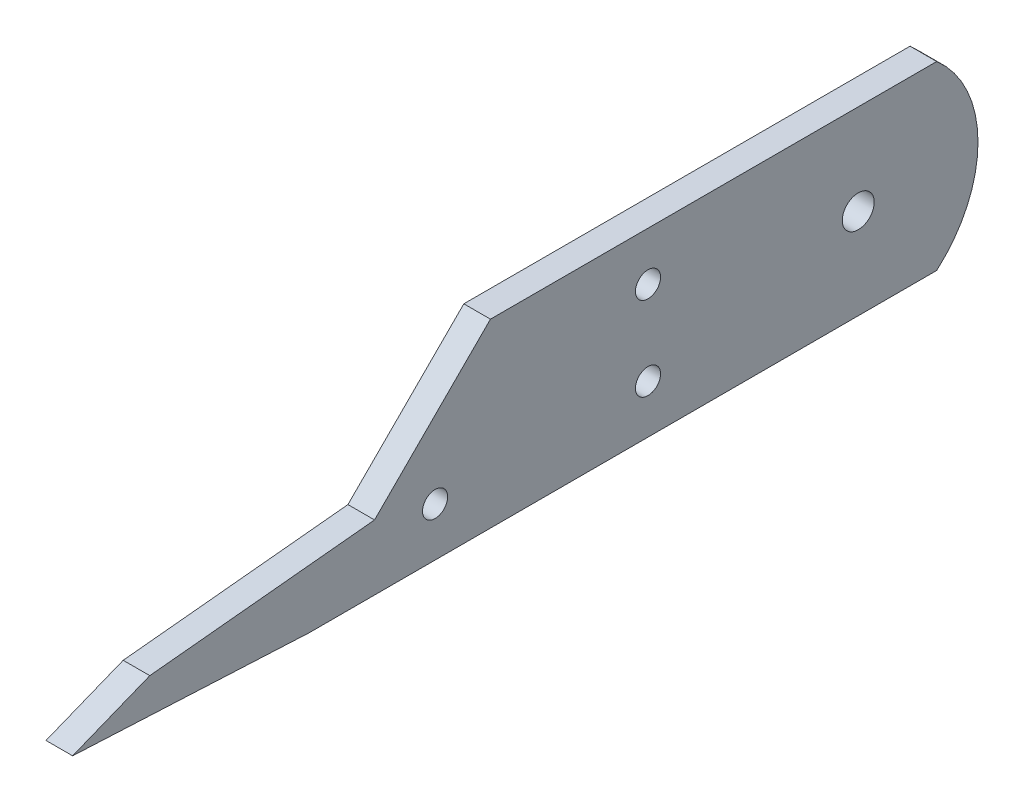
ISO-10303-21;
HEADER;
FILE_DESCRIPTION(('STEP AP214'),'2;1');
FILE_NAME('part.step','',(''),(''),'','','');
FILE_SCHEMA(('AUTOMOTIVE_DESIGN { 1 0 10303 214 1 1 1 1 }'));
ENDSEC;
DATA;
#1=APPLICATION_CONTEXT('core data for automotive mechanical design processes');
#2=APPLICATION_PROTOCOL_DEFINITION('international standard','automotive_design',2000,#1);
#3=PRODUCT_CONTEXT('',#1,'mechanical');
#4=PRODUCT('Part','Part','',(#3));
#5=PRODUCT_RELATED_PRODUCT_CATEGORY('part','',(#4));
#6=PRODUCT_DEFINITION_FORMATION('','',#4);
#7=PRODUCT_DEFINITION_CONTEXT('part definition',#1,'design');
#8=PRODUCT_DEFINITION('design','',#6,#7);
#9=PRODUCT_DEFINITION_SHAPE('','',#8);
#10=(LENGTH_UNIT() NAMED_UNIT(*) SI_UNIT(.MILLI.,.METRE.));
#11=(NAMED_UNIT(*) PLANE_ANGLE_UNIT() SI_UNIT($,.RADIAN.));
#12=(NAMED_UNIT(*) SI_UNIT($,.STERADIAN.) SOLID_ANGLE_UNIT());
#13=UNCERTAINTY_MEASURE_WITH_UNIT(LENGTH_MEASURE(1.E-05),#10,'distance_accuracy_value','');
#14=(GEOMETRIC_REPRESENTATION_CONTEXT(3) GLOBAL_UNCERTAINTY_ASSIGNED_CONTEXT((#13)) GLOBAL_UNIT_ASSIGNED_CONTEXT((#10,
#11,#12)) REPRESENTATION_CONTEXT('',''));
#15=CARTESIAN_POINT('',(0.,0.,0.));
#16=DIRECTION('',(0.,0.,1.));
#17=DIRECTION('',(1.,0.,0.));
#18=AXIS2_PLACEMENT_3D('',#15,#16,#17);
#19=CARTESIAN_POINT('',(6.35,43.18,0.));
#20=DIRECTION('',(0.,-1.,0.));
#21=DIRECTION('',(0.,0.,-1.));
#22=AXIS2_PLACEMENT_3D('',#19,#20,#21);
#23=PLANE('',#22);
#24=DIRECTION('',(0.,0.,1.));
#25=VECTOR('',#24,1.);
#26=CARTESIAN_POINT('',(0.,43.18,0.));
#27=LINE('',#26,#25);
#28=CARTESIAN_POINT('',(0.,43.18,-43.4811108330197));
#29=VERTEX_POINT('',#28);
#30=CARTESIAN_POINT('',(0.,43.18,62.9919999999995));
#31=VERTEX_POINT('',#30);
#32=EDGE_CURVE('E117',#29,#31,#27,.T.);
#33=ORIENTED_EDGE('',*,*,#32,.T.);
#34=DIRECTION('',(-1.,0.,0.));
#35=VECTOR('',#34,1.);
#36=CARTESIAN_POINT('',(6.35,43.18,62.9919999999995));
#37=LINE('',#36,#35);
#38=CARTESIAN_POINT('',(6.35,43.18,62.9919999999995));
#39=VERTEX_POINT('',#38);
#40=EDGE_CURVE('E11',#39,#31,#37,.T.);
#41=ORIENTED_EDGE('',*,*,#40,.F.);
#42=DIRECTION('',(0.,0.,1.));
#43=VECTOR('',#42,1.);
#44=CARTESIAN_POINT('',(6.35,43.18,0.));
#45=LINE('',#44,#43);
#46=CARTESIAN_POINT('',(6.34999999999999,43.18,-43.4811108330197));
#47=VERTEX_POINT('',#46);
#48=EDGE_CURVE('E103',#47,#39,#45,.T.);
#49=ORIENTED_EDGE('',*,*,#48,.F.);
#50=DIRECTION('',(-1.,0.,0.));
#51=VECTOR('',#50,1.);
#52=CARTESIAN_POINT('',(80.1238835157808,43.18,-43.4811108330197));
#53=LINE('',#52,#51);
#54=EDGE_CURVE('E112',#47,#29,#53,.T.);
#55=ORIENTED_EDGE('',*,*,#54,.T.);
#56=EDGE_LOOP('',(#33,#41,#49,#55));
#57=FACE_BOUND('',#56,.T.);
#58=ADVANCED_FACE('F33',(#57),#23,.F.);
#59=CARTESIAN_POINT('',(6.35,0.,106.172));
#60=DIRECTION('',(0.,-0.707106781186551,-0.707106781186544));
#61=DIRECTION('',(0.,0.707106781186544,-0.707106781186551));
#62=AXIS2_PLACEMENT_3D('',#59,#60,#61);
#63=PLANE('',#62);
#64=DIRECTION('',(0.,-0.707106781186544,0.707106781186551));
#65=VECTOR('',#64,1.);
#66=CARTESIAN_POINT('',(0.,0.,106.172));
#67=LINE('',#66,#65);
#68=CARTESIAN_POINT('',(0.,15.5222222222222,90.6497777777777));
#69=VERTEX_POINT('',#68);
#70=EDGE_CURVE('E104',#31,#69,#67,.T.);
#71=ORIENTED_EDGE('',*,*,#70,.T.);
#72=DIRECTION('',(1.,0.,0.));
#73=VECTOR('',#72,1.);
#74=CARTESIAN_POINT('',(6.35,15.5222222222222,90.6497777777776));
#75=LINE('',#74,#73);
#76=CARTESIAN_POINT('',(6.35,15.5222222222222,90.6497777777777));
#77=VERTEX_POINT('',#76);
#78=EDGE_CURVE('E55',#69,#77,#75,.T.);
#79=ORIENTED_EDGE('',*,*,#78,.T.);
#80=DIRECTION('',(0.,-0.707106781186544,0.707106781186551));
#81=VECTOR('',#80,1.);
#82=CARTESIAN_POINT('',(6.35,0.,106.172));
#83=LINE('',#82,#81);
#84=EDGE_CURVE('E168',#39,#77,#83,.T.);
#85=ORIENTED_EDGE('',*,*,#84,.F.);
#86=ORIENTED_EDGE('',*,*,#40,.T.);
#87=EDGE_LOOP('',(#71,#79,#85,#86));
#88=FACE_BOUND('',#87,.T.);
#89=ADVANCED_FACE('F172',(#88),#63,.F.);
#90=CARTESIAN_POINT('',(6.35,0.,0.));
#91=DIRECTION('',(0.,1.,0.));
#92=DIRECTION('',(0.,0.,1.));
#93=AXIS2_PLACEMENT_3D('',#90,#91,#92);
#94=PLANE('',#93);
#95=DIRECTION('',(0.,0.,-1.));
#96=VECTOR('',#95,1.);
#97=CARTESIAN_POINT('',(6.35,0.,0.));
#98=LINE('',#97,#96);
#99=CARTESIAN_POINT('',(6.35,0.,106.172));
#100=VERTEX_POINT('',#99);
#101=CARTESIAN_POINT('',(6.34999999999999,0.,-43.4811108330197));
#102=VERTEX_POINT('',#101);
#103=EDGE_CURVE('E40',#100,#102,#98,.T.);
#104=ORIENTED_EDGE('',*,*,#103,.F.);
#105=DIRECTION('',(1.,0.,0.));
#106=VECTOR('',#105,1.);
#107=CARTESIAN_POINT('',(0.,0.,106.172));
#108=LINE('',#107,#106);
#109=CARTESIAN_POINT('',(0.,0.,106.172));
#110=VERTEX_POINT('',#109);
#111=EDGE_CURVE('E99',#110,#100,#108,.T.);
#112=ORIENTED_EDGE('',*,*,#111,.F.);
#113=DIRECTION('',(0.,0.,-1.));
#114=VECTOR('',#113,1.);
#115=CARTESIAN_POINT('',(0.,0.,0.));
#116=LINE('',#115,#114);
#117=CARTESIAN_POINT('',(0.,0.,-43.4811108330197));
#118=VERTEX_POINT('',#117);
#119=EDGE_CURVE('E93',#110,#118,#116,.T.);
#120=ORIENTED_EDGE('',*,*,#119,.T.);
#121=DIRECTION('',(-1.,0.,0.));
#122=VECTOR('',#121,1.);
#123=CARTESIAN_POINT('',(80.1238835157808,0.,-43.4811108330197));
#124=LINE('',#123,#122);
#125=EDGE_CURVE('E97',#102,#118,#124,.T.);
#126=ORIENTED_EDGE('',*,*,#125,.F.);
#127=EDGE_LOOP('',(#104,#112,#120,#126));
#128=FACE_BOUND('',#127,.T.);
#129=ADVANCED_FACE('F96',(#128),#94,.F.);
#130=CARTESIAN_POINT('',(6.35,21.59,-24.7620690573304));
#131=DIRECTION('',(1.,0.,0.));
#132=DIRECTION('',(0.,0.,-1.));
#133=AXIS2_PLACEMENT_3D('',#130,#131,#132);
#134=PLANE('',#133);
#135=CARTESIAN_POINT('',(6.34999999999999,21.59,-24.7620690573304));
#136=DIRECTION('',(1.,0.,0.));
#137=DIRECTION('',(0.,0.,-1.));
#138=AXIS2_PLACEMENT_3D('',#135,#136,#137);
#139=CIRCLE('',#138,28.575);
#140=EDGE_CURVE('E111',#47,#102,#139,.F.);
#141=ORIENTED_EDGE('',*,*,#140,.F.);
#142=ORIENTED_EDGE('',*,*,#48,.T.);
#143=ORIENTED_EDGE('',*,*,#84,.T.);
#144=DIRECTION('',(0.,-0.0995037190209988,0.995037190209989));
#145=VECTOR('',#144,1.);
#146=CARTESIAN_POINT('',(6.35,10.16,144.272));
#147=LINE('',#146,#145);
#148=CARTESIAN_POINT('',(6.35,10.16,144.272));
#149=VERTEX_POINT('',#148);
#150=EDGE_CURVE('E152',#77,#149,#147,.T.);
#151=ORIENTED_EDGE('',*,*,#150,.T.);
#152=DIRECTION('',(0.,-0.371390676354104,0.928476690885259));
#153=VECTOR('',#152,1.);
#154=CARTESIAN_POINT('',(6.35,0.,169.672));
#155=LINE('',#154,#153);
#156=CARTESIAN_POINT('',(6.35,2.794,162.687));
#157=VERTEX_POINT('',#156);
#158=EDGE_CURVE('E159',#149,#157,#155,.T.);
#159=ORIENTED_EDGE('',*,*,#158,.T.);
#160=DIRECTION('',(0.,0.0493778959312991,0.998780167701281));
#161=VECTOR('',#160,1.);
#162=CARTESIAN_POINT('',(6.35,0.,106.172));
#163=LINE('',#162,#161);
#164=EDGE_CURVE('E47',#100,#157,#163,.T.);
#165=ORIENTED_EDGE('',*,*,#164,.F.);
#166=ORIENTED_EDGE('',*,*,#103,.T.);
#167=EDGE_LOOP('',(#141,#142,#143,#151,#159,#165,#166));
#168=FACE_BOUND('',#167,.T.);
#169=CARTESIAN_POINT('',(6.35,31.59,25.4));
#170=DIRECTION('',(1.,0.,0.));
#171=DIRECTION('',(0.,0.,-1.));
#172=AXIS2_PLACEMENT_3D('',#169,#170,#171);
#173=CIRCLE('',#172,3.);
#174=CARTESIAN_POINT('',(6.35,31.59,22.4));
#175=VERTEX_POINT('',#174);
#176=EDGE_CURVE('E133',#175,#175,#173,.T.);
#177=ORIENTED_EDGE('',*,*,#176,.F.);
#178=EDGE_LOOP('',(#177));
#179=FACE_BOUND('',#178,.T.);
#180=CARTESIAN_POINT('',(6.35,11.59,25.4));
#181=DIRECTION('',(1.,0.,0.));
#182=DIRECTION('',(0.,0.,-1.));
#183=AXIS2_PLACEMENT_3D('',#180,#181,#182);
#184=CIRCLE('',#183,3.);
#185=CARTESIAN_POINT('',(6.35,11.59,22.4));
#186=VERTEX_POINT('',#185);
#187=EDGE_CURVE('E139',#186,#186,#184,.T.);
#188=ORIENTED_EDGE('',*,*,#187,.F.);
#189=EDGE_LOOP('',(#188));
#190=FACE_BOUND('',#189,.T.);
#191=CARTESIAN_POINT('',(6.35,11.59,76.2));
#192=DIRECTION('',(1.,0.,0.));
#193=DIRECTION('',(0.,0.,-1.));
#194=AXIS2_PLACEMENT_3D('',#191,#192,#193);
#195=CIRCLE('',#194,3.00000000000001);
#196=CARTESIAN_POINT('',(6.35,11.59,73.2));
#197=VERTEX_POINT('',#196);
#198=EDGE_CURVE('E123',#197,#197,#195,.T.);
#199=ORIENTED_EDGE('',*,*,#198,.F.);
#200=EDGE_LOOP('',(#199));
#201=FACE_BOUND('',#200,.T.);
#202=CARTESIAN_POINT('',(6.34999999999999,21.59,-24.7620690573304));
#203=DIRECTION('',(1.,0.,0.));
#204=DIRECTION('',(0.,0.,-1.));
#205=AXIS2_PLACEMENT_3D('',#202,#203,#204);
#206=CIRCLE('',#205,3.81);
#207=CARTESIAN_POINT('',(6.34999999999998,21.59,-20.9520690573304));
#208=VERTEX_POINT('',#207);
#209=EDGE_CURVE('E119',#208,#208,#206,.F.);
#210=ORIENTED_EDGE('',*,*,#209,.T.);
#211=EDGE_LOOP('',(#210));
#212=FACE_BOUND('',#211,.T.);
#213=ADVANCED_FACE('F184',(#168,#179,#190,#201,#212),#134,.T.);
#214=CARTESIAN_POINT('',(0.,21.59,-24.7620690573304));
#215=DIRECTION('',(1.,0.,0.));
#216=DIRECTION('',(0.,0.,-1.));
#217=AXIS2_PLACEMENT_3D('',#214,#215,#216);
#218=PLANE('',#217);
#219=ORIENTED_EDGE('',*,*,#32,.F.);
#220=CARTESIAN_POINT('',(0.,21.59,-24.7620690573304));
#221=DIRECTION('',(-1.,0.,0.));
#222=DIRECTION('',(0.,0.,1.));
#223=AXIS2_PLACEMENT_3D('',#220,#221,#222);
#224=CIRCLE('',#223,28.575);
#225=EDGE_CURVE('E109',#29,#118,#224,.T.);
#226=ORIENTED_EDGE('',*,*,#225,.T.);
#227=ORIENTED_EDGE('',*,*,#119,.F.);
#228=DIRECTION('',(0.,0.0493778959312991,0.998780167701281));
#229=VECTOR('',#228,1.);
#230=CARTESIAN_POINT('',(0.,0.,106.172));
#231=LINE('',#230,#229);
#232=CARTESIAN_POINT('',(0.,2.794,162.687));
#233=VERTEX_POINT('',#232);
#234=EDGE_CURVE('E147',#110,#233,#231,.T.);
#235=ORIENTED_EDGE('',*,*,#234,.T.);
#236=DIRECTION('',(0.,0.371390676354104,-0.928476690885259));
#237=VECTOR('',#236,1.);
#238=CARTESIAN_POINT('',(0.,0.,169.672));
#239=LINE('',#238,#237);
#240=CARTESIAN_POINT('',(0.,10.16,144.272));
#241=VERTEX_POINT('',#240);
#242=EDGE_CURVE('E154',#233,#241,#239,.T.);
#243=ORIENTED_EDGE('',*,*,#242,.T.);
#244=DIRECTION('',(0.,0.0995037190209988,-0.995037190209989));
#245=VECTOR('',#244,1.);
#246=CARTESIAN_POINT('',(0.,10.16,144.272));
#247=LINE('',#246,#245);
#248=EDGE_CURVE('E156',#241,#69,#247,.T.);
#249=ORIENTED_EDGE('',*,*,#248,.T.);
#250=ORIENTED_EDGE('',*,*,#70,.F.);
#251=EDGE_LOOP('',(#219,#226,#227,#235,#243,#249,#250));
#252=FACE_BOUND('',#251,.T.);
#253=CARTESIAN_POINT('',(0.,31.59,25.4));
#254=DIRECTION('',(1.,0.,0.));
#255=DIRECTION('',(0.,0.,-1.));
#256=AXIS2_PLACEMENT_3D('',#253,#254,#255);
#257=CIRCLE('',#256,3.);
#258=CARTESIAN_POINT('',(0.,31.59,22.4));
#259=VERTEX_POINT('',#258);
#260=EDGE_CURVE('E130',#259,#259,#257,.T.);
#261=ORIENTED_EDGE('',*,*,#260,.T.);
#262=EDGE_LOOP('',(#261));
#263=FACE_BOUND('',#262,.T.);
#264=CARTESIAN_POINT('',(0.,11.59,25.4));
#265=DIRECTION('',(1.,0.,0.));
#266=DIRECTION('',(0.,0.,-1.));
#267=AXIS2_PLACEMENT_3D('',#264,#265,#266);
#268=CIRCLE('',#267,3.);
#269=CARTESIAN_POINT('',(0.,11.59,22.4));
#270=VERTEX_POINT('',#269);
#271=EDGE_CURVE('E136',#270,#270,#268,.T.);
#272=ORIENTED_EDGE('',*,*,#271,.T.);
#273=EDGE_LOOP('',(#272));
#274=FACE_BOUND('',#273,.T.);
#275=CARTESIAN_POINT('',(0.,11.59,76.2));
#276=DIRECTION('',(1.,0.,0.));
#277=DIRECTION('',(0.,0.,-1.));
#278=AXIS2_PLACEMENT_3D('',#275,#276,#277);
#279=CIRCLE('',#278,3.00000000000001);
#280=CARTESIAN_POINT('',(0.,11.59,73.2));
#281=VERTEX_POINT('',#280);
#282=EDGE_CURVE('E142',#281,#281,#279,.T.);
#283=ORIENTED_EDGE('',*,*,#282,.T.);
#284=EDGE_LOOP('',(#283));
#285=FACE_BOUND('',#284,.T.);
#286=CARTESIAN_POINT('',(0.,21.59,-24.7620690573304));
#287=DIRECTION('',(-1.,0.,0.));
#288=DIRECTION('',(0.,0.,1.));
#289=AXIS2_PLACEMENT_3D('',#286,#287,#288);
#290=CIRCLE('',#289,3.81);
#291=CARTESIAN_POINT('',(0.,21.59,-20.9520690573304));
#292=VERTEX_POINT('',#291);
#293=EDGE_CURVE('E120',#292,#292,#290,.T.);
#294=ORIENTED_EDGE('',*,*,#293,.F.);
#295=EDGE_LOOP('',(#294));
#296=FACE_BOUND('',#295,.T.);
#297=ADVANCED_FACE('F114',(#252,#263,#274,#285,#296),#218,.F.);
#298=CARTESIAN_POINT('',(-103.144017761575,10.16,144.272));
#299=DIRECTION('',(0.,0.995037190209989,0.0995037190209988));
#300=DIRECTION('',(0.,-0.0995037190209988,0.995037190209989));
#301=AXIS2_PLACEMENT_3D('',#298,#299,#300);
#302=PLANE('',#301);
#303=ORIENTED_EDGE('',*,*,#78,.F.);
#304=ORIENTED_EDGE('',*,*,#248,.F.);
#305=DIRECTION('',(1.,0.,0.));
#306=VECTOR('',#305,1.);
#307=CARTESIAN_POINT('',(-103.144017761575,10.16,144.272));
#308=LINE('',#307,#306);
#309=EDGE_CURVE('E157',#241,#149,#308,.T.);
#310=ORIENTED_EDGE('',*,*,#309,.T.);
#311=ORIENTED_EDGE('',*,*,#150,.F.);
#312=EDGE_LOOP('',(#303,#304,#310,#311));
#313=FACE_BOUND('',#312,.T.);
#314=ADVANCED_FACE('F177',(#313),#302,.T.);
#315=CARTESIAN_POINT('',(-103.144017761575,0.,169.672));
#316=DIRECTION('',(0.,0.928476690885259,0.371390676354104));
#317=DIRECTION('',(0.,-0.371390676354104,0.928476690885259));
#318=AXIS2_PLACEMENT_3D('',#315,#316,#317);
#319=PLANE('',#318);
#320=DIRECTION('',(1.,0.,0.));
#321=VECTOR('',#320,1.);
#322=CARTESIAN_POINT('',(0.,2.794,162.687));
#323=LINE('',#322,#321);
#324=EDGE_CURVE('E150',#233,#157,#323,.T.);
#325=ORIENTED_EDGE('',*,*,#324,.T.);
#326=ORIENTED_EDGE('',*,*,#158,.F.);
#327=ORIENTED_EDGE('',*,*,#309,.F.);
#328=ORIENTED_EDGE('',*,*,#242,.F.);
#329=EDGE_LOOP('',(#325,#326,#327,#328));
#330=FACE_BOUND('',#329,.T.);
#331=ADVANCED_FACE('F182',(#330),#319,.T.);
#332=CARTESIAN_POINT('',(0.,0.,106.172));
#333=DIRECTION('',(0.,0.99878016770128,-0.0493778959312991));
#334=DIRECTION('',(0.,0.0493778959312991,0.998780167701281));
#335=AXIS2_PLACEMENT_3D('',#332,#333,#334);
#336=PLANE('',#335);
#337=ORIENTED_EDGE('',*,*,#164,.T.);
#338=ORIENTED_EDGE('',*,*,#324,.F.);
#339=ORIENTED_EDGE('',*,*,#234,.F.);
#340=ORIENTED_EDGE('',*,*,#111,.T.);
#341=EDGE_LOOP('',(#337,#338,#339,#340));
#342=FACE_BOUND('',#341,.T.);
#343=ADVANCED_FACE('F204',(#342),#336,.F.);
#344=CARTESIAN_POINT('',(0.,11.59,76.2));
#345=DIRECTION('',(1.,0.,0.));
#346=DIRECTION('',(0.,0.,-1.));
#347=AXIS2_PLACEMENT_3D('',#344,#345,#346);
#348=CYLINDRICAL_SURFACE('',#347,3.00000000000001);
#349=ORIENTED_EDGE('',*,*,#282,.F.);
#350=EDGE_LOOP('',(#349));
#351=FACE_BOUND('',#350,.T.);
#352=ORIENTED_EDGE('',*,*,#198,.T.);
#353=EDGE_LOOP('',(#352));
#354=FACE_BOUND('',#353,.T.);
#355=ADVANCED_FACE('F207',(#351,#354),#348,.F.);
#356=CARTESIAN_POINT('',(0.,11.59,25.4));
#357=DIRECTION('',(1.,0.,0.));
#358=DIRECTION('',(0.,0.,-1.));
#359=AXIS2_PLACEMENT_3D('',#356,#357,#358);
#360=CYLINDRICAL_SURFACE('',#359,3.);
#361=ORIENTED_EDGE('',*,*,#271,.F.);
#362=EDGE_LOOP('',(#361));
#363=FACE_BOUND('',#362,.T.);
#364=ORIENTED_EDGE('',*,*,#187,.T.);
#365=EDGE_LOOP('',(#364));
#366=FACE_BOUND('',#365,.T.);
#367=ADVANCED_FACE('F210',(#363,#366),#360,.F.);
#368=CARTESIAN_POINT('',(0.,31.59,25.4));
#369=DIRECTION('',(1.,0.,0.));
#370=DIRECTION('',(0.,0.,-1.));
#371=AXIS2_PLACEMENT_3D('',#368,#369,#370);
#372=CYLINDRICAL_SURFACE('',#371,3.);
#373=ORIENTED_EDGE('',*,*,#260,.F.);
#374=EDGE_LOOP('',(#373));
#375=FACE_BOUND('',#374,.T.);
#376=ORIENTED_EDGE('',*,*,#176,.T.);
#377=EDGE_LOOP('',(#376));
#378=FACE_BOUND('',#377,.T.);
#379=ADVANCED_FACE('F214',(#375,#378),#372,.F.);
#380=CARTESIAN_POINT('',(80.1238835157808,21.59,-24.7620690573304));
#381=DIRECTION('',(-1.,0.,0.));
#382=DIRECTION('',(0.,0.,1.));
#383=AXIS2_PLACEMENT_3D('',#380,#381,#382);
#384=CYLINDRICAL_SURFACE('',#383,28.575);
#385=ORIENTED_EDGE('',*,*,#54,.F.);
#386=ORIENTED_EDGE('',*,*,#140,.T.);
#387=ORIENTED_EDGE('',*,*,#125,.T.);
#388=ORIENTED_EDGE('',*,*,#225,.F.);
#389=EDGE_LOOP('',(#385,#386,#387,#388));
#390=FACE_BOUND('',#389,.T.);
#391=ADVANCED_FACE('F108',(#390),#384,.T.);
#392=CARTESIAN_POINT('',(80.1238835157808,21.59,-24.7620690573304));
#393=DIRECTION('',(-1.,0.,0.));
#394=DIRECTION('',(0.,0.,1.));
#395=AXIS2_PLACEMENT_3D('',#392,#393,#394);
#396=CYLINDRICAL_SURFACE('',#395,3.81);
#397=CARTESIAN_POINT('',(0.,21.59,-20.9520690573304));
#398=CARTESIAN_POINT('',(0.0661458333333457,21.59,-20.9520690573304));
#399=CARTESIAN_POINT('',(0.132291666666678,21.59,-20.9520690573304));
#400=CARTESIAN_POINT('',(0.264583333333341,21.59,-20.9520690573304));
#401=CARTESIAN_POINT('',(0.330729166666673,21.59,-20.9520690573304));
#402=CARTESIAN_POINT('',(0.463020833333341,21.59,-20.9520690573304));
#403=CARTESIAN_POINT('',(0.529166666666678,21.59,-20.9520690573304));
#404=CARTESIAN_POINT('',(0.661458333333346,21.59,-20.9520690573304));
#405=CARTESIAN_POINT('',(0.727604166666678,21.59,-20.9520690573304));
#406=CARTESIAN_POINT('',(0.859895833333342,21.59,-20.9520690573304));
#407=CARTESIAN_POINT('',(0.926041666666673,21.59,-20.9520690573304));
#408=CARTESIAN_POINT('',(1.05833333333334,21.59,-20.9520690573304));
#409=CARTESIAN_POINT('',(1.12447916666668,21.59,-20.9520690573304));
#410=CARTESIAN_POINT('',(1.25677083333335,21.59,-20.9520690573304));
#411=CARTESIAN_POINT('',(1.32291666666668,21.59,-20.9520690573304));
#412=CARTESIAN_POINT('',(1.45520833333334,21.59,-20.9520690573304));
#413=CARTESIAN_POINT('',(1.52135416666667,21.59,-20.9520690573304));
#414=CARTESIAN_POINT('',(1.65364583333334,21.59,-20.9520690573304));
#415=CARTESIAN_POINT('',(1.71979166666667,21.59,-20.9520690573304));
#416=CARTESIAN_POINT('',(1.85208333333333,21.59,-20.9520690573304));
#417=CARTESIAN_POINT('',(1.91822916666666,21.59,-20.9520690573304));
#418=CARTESIAN_POINT('',(2.05052083333333,21.59,-20.9520690573304));
#419=CARTESIAN_POINT('',(2.11666666666667,21.59,-20.9520690573304));
#420=CARTESIAN_POINT('',(2.24895833333334,21.59,-20.9520690573304));
#421=CARTESIAN_POINT('',(2.31510416666667,21.59,-20.9520690573304));
#422=CARTESIAN_POINT('',(2.44739583333333,21.59,-20.9520690573304));
#423=CARTESIAN_POINT('',(2.51354166666667,21.59,-20.9520690573304));
#424=CARTESIAN_POINT('',(2.64583333333333,21.59,-20.9520690573304));
#425=CARTESIAN_POINT('',(2.71197916666667,21.59,-20.9520690573304));
#426=CARTESIAN_POINT('',(2.84427083333334,21.59,-20.9520690573304));
#427=CARTESIAN_POINT('',(2.91041666666667,21.59,-20.9520690573304));
#428=CARTESIAN_POINT('',(3.04270833333333,21.59,-20.9520690573304));
#429=CARTESIAN_POINT('',(3.10885416666667,21.59,-20.9520690573304));
#430=CARTESIAN_POINT('',(3.24114583333333,21.59,-20.9520690573304));
#431=CARTESIAN_POINT('',(3.30729166666666,21.59,-20.9520690573304));
#432=CARTESIAN_POINT('',(3.43958333333332,21.59,-20.9520690573304));
#433=CARTESIAN_POINT('',(3.50572916666666,21.59,-20.9520690573304));
#434=CARTESIAN_POINT('',(3.63802083333332,21.59,-20.9520690573304));
#435=CARTESIAN_POINT('',(3.70416666666666,21.59,-20.9520690573304));
#436=CARTESIAN_POINT('',(3.83645833333333,21.59,-20.9520690573304));
#437=CARTESIAN_POINT('',(3.90260416666666,21.59,-20.9520690573304));
#438=CARTESIAN_POINT('',(4.03489583333333,21.59,-20.9520690573304));
#439=CARTESIAN_POINT('',(4.10104166666666,21.59,-20.9520690573304));
#440=CARTESIAN_POINT('',(4.23333333333333,21.59,-20.9520690573304));
#441=CARTESIAN_POINT('',(4.29947916666666,21.59,-20.9520690573304));
#442=CARTESIAN_POINT('',(4.43177083333333,21.59,-20.9520690573304));
#443=CARTESIAN_POINT('',(4.49791666666666,21.59,-20.9520690573304));
#444=CARTESIAN_POINT('',(4.63020833333333,21.59,-20.9520690573304));
#445=CARTESIAN_POINT('',(4.69635416666666,21.59,-20.9520690573304));
#446=CARTESIAN_POINT('',(4.82864583333332,21.59,-20.9520690573304));
#447=CARTESIAN_POINT('',(4.89479166666665,21.59,-20.9520690573304));
#448=CARTESIAN_POINT('',(5.02708333333332,21.59,-20.9520690573304));
#449=CARTESIAN_POINT('',(5.09322916666665,21.59,-20.9520690573304));
#450=CARTESIAN_POINT('',(5.22552083333332,21.59,-20.9520690573304));
#451=CARTESIAN_POINT('',(5.29166666666665,21.59,-20.9520690573304));
#452=CARTESIAN_POINT('',(5.42395833333332,21.59,-20.9520690573304));
#453=CARTESIAN_POINT('',(5.49010416666665,21.59,-20.9520690573304));
#454=CARTESIAN_POINT('',(5.62239583333332,21.59,-20.9520690573304));
#455=CARTESIAN_POINT('',(5.68854166666665,21.59,-20.9520690573304));
#456=CARTESIAN_POINT('',(5.82083333333332,21.59,-20.9520690573304));
#457=CARTESIAN_POINT('',(5.88697916666665,21.59,-20.9520690573304));
#458=CARTESIAN_POINT('',(6.01927083333332,21.59,-20.9520690573304));
#459=CARTESIAN_POINT('',(6.08541666666665,21.59,-20.9520690573304));
#460=CARTESIAN_POINT('',(6.21770833333332,21.59,-20.9520690573304));
#461=CARTESIAN_POINT('',(6.28385416666665,21.59,-20.9520690573304));
#462=CARTESIAN_POINT('',(6.34999999999998,21.59,-20.9520690573304));
#463=B_SPLINE_CURVE_WITH_KNOTS('',3,(#397,#398,#399,#400,#401,#402,#403,#404,#405,#406,#407,
#408,#409,#410,#411,#412,#413,#414,#415,#416,#417,#418,#419,#420,#421,#422,#423,#424,#425,#426,
#427,#428,#429,#430,#431,#432,#433,#434,#435,#436,#437,#438,#439,#440,#441,#442,#443,#444,#445,
#446,#447,#448,#449,#450,#451,#452,#453,#454,#455,#456,#457,#458,#459,#460,#461,#462),
.UNSPECIFIED.,.F.,.F.,(4,2,2,2,2,2,2,2,2,2,2,2,2,2,2,2,2,2,2,2,2,2,2,2,2,2,2,2,2,2,2,2,4),(0.,
0.198437499999995,0.396874999999991,0.5953125,0.793749999999996,0.992187499999991,1.190625,
1.3890625,1.58749999999999,1.78593749999999,1.98437499999998,2.18281249999999,2.38124999999999,
2.57968749999998,2.77812499999999,2.97656249999999,3.17499999999998,3.37343749999998,
3.57187499999997,3.77031249999998,3.96874999999998,4.16718749999997,4.36562499999998,
4.56406249999998,4.76249999999998,4.96093749999997,5.15937499999997,5.35781249999998,
5.55624999999997,5.75468749999997,5.95312499999998,6.15156249999997,6.34999999999997),.UNSPECIFIED.);
#464=EDGE_CURVE('BSEAM219',#292,#208,#463,.T.);
#465=ORIENTED_EDGE('',*,*,#293,.T.);
#466=ORIENTED_EDGE('',*,*,#209,.F.);
#467=ORIENTED_EDGE('',*,*,#464,.T.);
#468=ORIENTED_EDGE('',*,*,#464,.F.);
#469=EDGE_LOOP('',(#465,#467,#466,#468));
#470=FACE_BOUND('',#469,.T.);
#471=ADVANCED_FACE('F219',(#470),#396,.F.);
#472=CLOSED_SHELL('',(#58,#89,#129,#213,#297,#314,#331,#343,#355,#367,#379,#391,#471));
#473=MANIFOLD_SOLID_BREP('B2',#472);
#474=ADVANCED_BREP_SHAPE_REPRESENTATION('',(#18,#473),#14);
#475=SHAPE_DEFINITION_REPRESENTATION(#9,#474);
ENDSEC;
END-ISO-10303-21;
